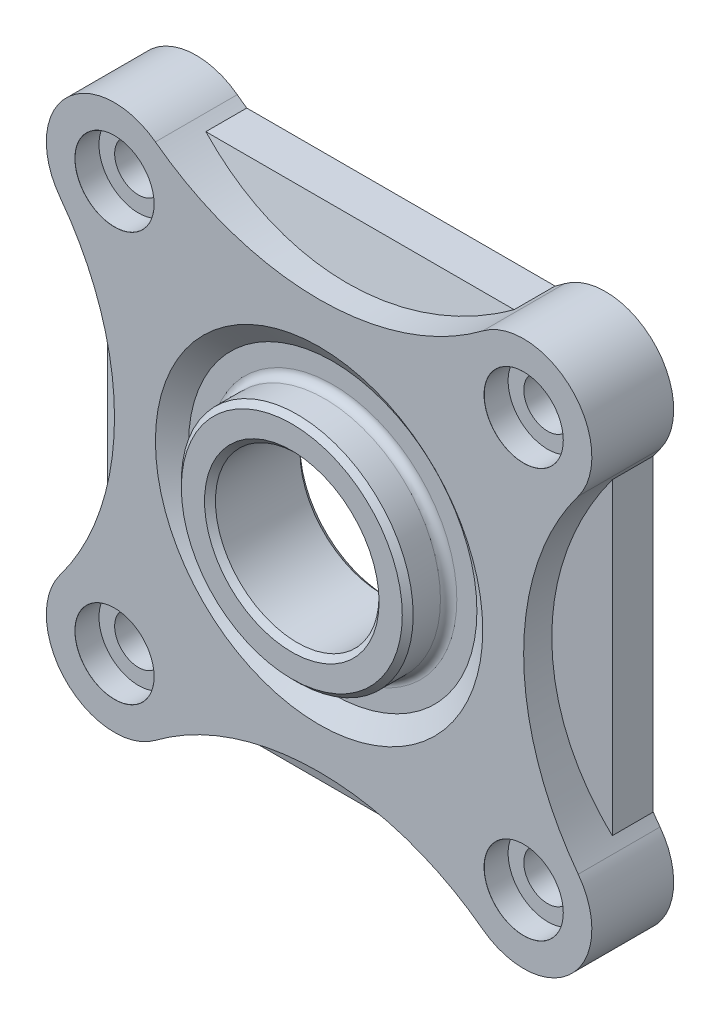
ISO-10303-21;
HEADER;
FILE_DESCRIPTION(('STEP AP214'),'2;1');
FILE_NAME('part.step','',(''),(''),'','','');
FILE_SCHEMA(('AUTOMOTIVE_DESIGN { 1 0 10303 214 1 1 1 1 }'));
ENDSEC;
DATA;
#1=APPLICATION_CONTEXT('core data for automotive mechanical design processes');
#2=APPLICATION_PROTOCOL_DEFINITION('international standard','automotive_design',2000,#1);
#3=PRODUCT_CONTEXT('',#1,'mechanical');
#4=PRODUCT('Part','Part','',(#3));
#5=PRODUCT_RELATED_PRODUCT_CATEGORY('part','',(#4));
#6=PRODUCT_DEFINITION_FORMATION('','',#4);
#7=PRODUCT_DEFINITION_CONTEXT('part definition',#1,'design');
#8=PRODUCT_DEFINITION('design','',#6,#7);
#9=PRODUCT_DEFINITION_SHAPE('','',#8);
#10=(LENGTH_UNIT() NAMED_UNIT(*) SI_UNIT(.MILLI.,.METRE.));
#11=(NAMED_UNIT(*) PLANE_ANGLE_UNIT() SI_UNIT($,.RADIAN.));
#12=(NAMED_UNIT(*) SI_UNIT($,.STERADIAN.) SOLID_ANGLE_UNIT());
#13=UNCERTAINTY_MEASURE_WITH_UNIT(LENGTH_MEASURE(1.E-05),#10,'distance_accuracy_value','');
#14=(GEOMETRIC_REPRESENTATION_CONTEXT(3) GLOBAL_UNCERTAINTY_ASSIGNED_CONTEXT((#13)) GLOBAL_UNIT_ASSIGNED_CONTEXT((#10,
#11,#12)) REPRESENTATION_CONTEXT('',''));
#15=CARTESIAN_POINT('',(0.,0.,0.));
#16=DIRECTION('',(0.,0.,1.));
#17=DIRECTION('',(1.,0.,0.));
#18=AXIS2_PLACEMENT_3D('',#15,#16,#17);
#19=CARTESIAN_POINT('',(0.,0.,0.));
#20=DIRECTION('',(0.,0.,1.));
#21=DIRECTION('',(1.,0.,0.));
#22=AXIS2_PLACEMENT_3D('',#19,#20,#21);
#23=CYLINDRICAL_SURFACE('',#22,30.);
#24=CARTESIAN_POINT('',(0.,0.,7.00000000000001));
#25=DIRECTION('',(0.,0.,-1.));
#26=DIRECTION('',(-1.,0.,0.));
#27=AXIS2_PLACEMENT_3D('',#24,#25,#26);
#28=CIRCLE('',#27,30.);
#29=CARTESIAN_POINT('',(-30.,0.,7.00000000000001));
#30=VERTEX_POINT('',#29);
#31=EDGE_CURVE('E280',#30,#30,#28,.T.);
#32=ORIENTED_EDGE('',*,*,#31,.T.);
#33=EDGE_LOOP('',(#32));
#34=FACE_BOUND('',#33,.T.);
#35=CARTESIAN_POINT('',(0.,0.,38.));
#36=DIRECTION('',(0.,0.,1.));
#37=DIRECTION('',(1.,0.,0.));
#38=AXIS2_PLACEMENT_3D('',#35,#36,#37);
#39=CIRCLE('',#38,30.);
#40=CARTESIAN_POINT('',(30.,0.,38.));
#41=VERTEX_POINT('',#40);
#42=EDGE_CURVE('E276',#41,#41,#39,.T.);
#43=ORIENTED_EDGE('',*,*,#42,.T.);
#44=EDGE_LOOP('',(#43));
#45=FACE_BOUND('',#44,.T.);
#46=ADVANCED_FACE('F45',(#34,#45),#23,.F.);
#47=CARTESIAN_POINT('',(0.,-175.,30.));
#48=DIRECTION('',(0.,0.,-1.));
#49=DIRECTION('',(-1.,0.,0.));
#50=AXIS2_PLACEMENT_3D('',#47,#48,#49);
#51=CYLINDRICAL_SURFACE('',#50,100.);
#52=CARTESIAN_POINT('',(0.,-175.,-7.10580837556768));
#53=DIRECTION('',(0.,-0.258819045102521,0.965925826289068));
#54=DIRECTION('',(0.,-0.965925826289068,-0.258819045102521));
#55=AXIS2_PLACEMENT_3D('',#52,#53,#54);
#56=ELLIPSE('',#55,103.527618041008,100.);
#57=CARTESIAN_POINT('',(-56.5132727772866,-92.5,15.));
#58=VERTEX_POINT('',#57);
#59=CARTESIAN_POINT('',(56.5132727772866,-92.5,15.));
#60=VERTEX_POINT('',#59);
#61=EDGE_CURVE('E177',#58,#60,#56,.F.);
#62=ORIENTED_EDGE('',*,*,#61,.T.);
#63=DIRECTION('',(0.,0.,-1.));
#64=VECTOR('',#63,1.);
#65=CARTESIAN_POINT('',(56.5132727772866,-92.5,30.));
#66=LINE('',#65,#64);
#67=CARTESIAN_POINT('',(56.5132727772866,-92.5,0.));
#68=VERTEX_POINT('',#67);
#69=EDGE_CURVE('E162',#60,#68,#66,.T.);
#70=ORIENTED_EDGE('',*,*,#69,.T.);
#71=CARTESIAN_POINT('',(0.,-175.,0.));
#72=DIRECTION('',(0.,0.,1.));
#73=DIRECTION('',(1.,0.,0.));
#74=AXIS2_PLACEMENT_3D('',#71,#72,#73);
#75=CIRCLE('',#74,100.);
#76=CARTESIAN_POINT('',(60.,-95.,0.));
#77=VERTEX_POINT('',#76);
#78=EDGE_CURVE('E176',#77,#68,#75,.T.);
#79=ORIENTED_EDGE('',*,*,#78,.F.);
#80=DIRECTION('',(0.,0.,-1.));
#81=VECTOR('',#80,1.);
#82=CARTESIAN_POINT('',(60.,-95.,30.));
#83=LINE('',#82,#81);
#84=CARTESIAN_POINT('',(60.,-95.,30.));
#85=VERTEX_POINT('',#84);
#86=EDGE_CURVE('E246',#85,#77,#83,.T.);
#87=ORIENTED_EDGE('',*,*,#86,.F.);
#88=CARTESIAN_POINT('',(0.,-175.,30.));
#89=DIRECTION('',(0.,0.,1.));
#90=DIRECTION('',(1.,0.,0.));
#91=AXIS2_PLACEMENT_3D('',#88,#89,#90);
#92=CIRCLE('',#91,100.);
#93=CARTESIAN_POINT('',(-60.,-95.,30.));
#94=VERTEX_POINT('',#93);
#95=EDGE_CURVE('E220',#85,#94,#92,.T.);
#96=ORIENTED_EDGE('',*,*,#95,.T.);
#97=DIRECTION('',(0.,0.,-1.));
#98=VECTOR('',#97,1.);
#99=CARTESIAN_POINT('',(-60.,-95.,30.));
#100=LINE('',#99,#98);
#101=CARTESIAN_POINT('',(-60.,-95.,0.));
#102=VERTEX_POINT('',#101);
#103=EDGE_CURVE('E221',#94,#102,#100,.T.);
#104=ORIENTED_EDGE('',*,*,#103,.T.);
#105=CARTESIAN_POINT('',(-56.5132727772866,-92.5,0.));
#106=VERTEX_POINT('',#105);
#107=EDGE_CURVE('E186',#106,#102,#75,.T.);
#108=ORIENTED_EDGE('',*,*,#107,.F.);
#109=DIRECTION('',(0.,0.,-1.));
#110=VECTOR('',#109,1.);
#111=CARTESIAN_POINT('',(-56.5132727772866,-92.5,30.));
#112=LINE('',#111,#110);
#113=EDGE_CURVE('E165',#106,#58,#112,.F.);
#114=ORIENTED_EDGE('',*,*,#113,.T.);
#115=EDGE_LOOP('',(#62,#70,#79,#87,#96,#104,#108,#114));
#116=FACE_BOUND('',#115,.T.);
#117=ADVANCED_FACE('F175',(#116),#51,.F.);
#118=CARTESIAN_POINT('',(175.,0.,30.));
#119=DIRECTION('',(0.,0.,-1.));
#120=DIRECTION('',(-1.,0.,0.));
#121=AXIS2_PLACEMENT_3D('',#118,#119,#120);
#122=CYLINDRICAL_SURFACE('',#121,100.);
#123=CARTESIAN_POINT('',(175.,0.,-7.10580837556767));
#124=DIRECTION('',(0.258819045102521,0.,0.965925826289068));
#125=DIRECTION('',(0.965925826289068,0.,-0.258819045102521));
#126=AXIS2_PLACEMENT_3D('',#123,#124,#125);
#127=ELLIPSE('',#126,103.527618041008,100.);
#128=CARTESIAN_POINT('',(92.5,-56.5132727772866,15.));
#129=VERTEX_POINT('',#128);
#130=CARTESIAN_POINT('',(92.5,56.5132727772866,15.));
#131=VERTEX_POINT('',#130);
#132=EDGE_CURVE('E250',#129,#131,#127,.F.);
#133=ORIENTED_EDGE('',*,*,#132,.T.);
#134=DIRECTION('',(0.,0.,-1.));
#135=VECTOR('',#134,1.);
#136=CARTESIAN_POINT('',(92.5,56.5132727772866,30.));
#137=LINE('',#136,#135);
#138=CARTESIAN_POINT('',(92.5,56.5132727772867,0.));
#139=VERTEX_POINT('',#138);
#140=EDGE_CURVE('E258',#131,#139,#137,.T.);
#141=ORIENTED_EDGE('',*,*,#140,.T.);
#142=CARTESIAN_POINT('',(175.,0.,0.));
#143=DIRECTION('',(0.,0.,1.));
#144=DIRECTION('',(1.,0.,0.));
#145=AXIS2_PLACEMENT_3D('',#142,#143,#144);
#146=CIRCLE('',#145,100.);
#147=CARTESIAN_POINT('',(95.,60.,0.));
#148=VERTEX_POINT('',#147);
#149=EDGE_CURVE('E196',#148,#139,#146,.T.);
#150=ORIENTED_EDGE('',*,*,#149,.F.);
#151=DIRECTION('',(0.,0.,-1.));
#152=VECTOR('',#151,1.);
#153=CARTESIAN_POINT('',(95.,60.,30.));
#154=LINE('',#153,#152);
#155=CARTESIAN_POINT('',(95.,60.,30.));
#156=VERTEX_POINT('',#155);
#157=EDGE_CURVE('E239',#156,#148,#154,.T.);
#158=ORIENTED_EDGE('',*,*,#157,.F.);
#159=CARTESIAN_POINT('',(175.,0.,30.));
#160=DIRECTION('',(0.,0.,1.));
#161=DIRECTION('',(1.,0.,0.));
#162=AXIS2_PLACEMENT_3D('',#159,#160,#161);
#163=CIRCLE('',#162,100.);
#164=CARTESIAN_POINT('',(95.,-60.,30.));
#165=VERTEX_POINT('',#164);
#166=EDGE_CURVE('E614',#156,#165,#163,.T.);
#167=ORIENTED_EDGE('',*,*,#166,.T.);
#168=DIRECTION('',(0.,0.,-1.));
#169=VECTOR('',#168,1.);
#170=CARTESIAN_POINT('',(95.,-60.,30.));
#171=LINE('',#170,#169);
#172=CARTESIAN_POINT('',(95.,-60.,0.));
#173=VERTEX_POINT('',#172);
#174=EDGE_CURVE('E242',#165,#173,#171,.T.);
#175=ORIENTED_EDGE('',*,*,#174,.T.);
#176=CARTESIAN_POINT('',(92.5,-56.5132727772866,0.));
#177=VERTEX_POINT('',#176);
#178=EDGE_CURVE('E190',#177,#173,#146,.T.);
#179=ORIENTED_EDGE('',*,*,#178,.F.);
#180=DIRECTION('',(0.,0.,-1.));
#181=VECTOR('',#180,1.);
#182=CARTESIAN_POINT('',(92.5,-56.5132727772866,30.));
#183=LINE('',#182,#181);
#184=EDGE_CURVE('E601',#177,#129,#183,.F.);
#185=ORIENTED_EDGE('',*,*,#184,.T.);
#186=EDGE_LOOP('',(#133,#141,#150,#158,#167,#175,#179,#185));
#187=FACE_BOUND('',#186,.T.);
#188=ADVANCED_FACE('F306',(#187),#122,.F.);
#189=CARTESIAN_POINT('',(0.,175.,30.));
#190=DIRECTION('',(0.,0.,-1.));
#191=DIRECTION('',(-1.,0.,0.));
#192=AXIS2_PLACEMENT_3D('',#189,#190,#191);
#193=CYLINDRICAL_SURFACE('',#192,100.);
#194=CARTESIAN_POINT('',(0.,175.,-7.10580837556768));
#195=DIRECTION('',(0.,0.258819045102521,0.965925826289068));
#196=DIRECTION('',(0.,0.965925826289068,-0.258819045102521));
#197=AXIS2_PLACEMENT_3D('',#194,#195,#196);
#198=ELLIPSE('',#197,103.527618041008,100.);
#199=CARTESIAN_POINT('',(56.5132727772866,92.5,15.));
#200=VERTEX_POINT('',#199);
#201=CARTESIAN_POINT('',(-56.5132727772866,92.5,15.));
#202=VERTEX_POINT('',#201);
#203=EDGE_CURVE('E254',#200,#202,#198,.F.);
#204=ORIENTED_EDGE('',*,*,#203,.T.);
#205=DIRECTION('',(0.,0.,-1.));
#206=VECTOR('',#205,1.);
#207=CARTESIAN_POINT('',(-56.5132727772866,92.5,30.));
#208=LINE('',#207,#206);
#209=CARTESIAN_POINT('',(-56.5132727772866,92.5,0.));
#210=VERTEX_POINT('',#209);
#211=EDGE_CURVE('E597',#202,#210,#208,.T.);
#212=ORIENTED_EDGE('',*,*,#211,.T.);
#213=CARTESIAN_POINT('',(0.,175.,0.));
#214=DIRECTION('',(0.,0.,1.));
#215=DIRECTION('',(1.,0.,0.));
#216=AXIS2_PLACEMENT_3D('',#213,#214,#215);
#217=CIRCLE('',#216,100.);
#218=CARTESIAN_POINT('',(-60.,95.,0.));
#219=VERTEX_POINT('',#218);
#220=EDGE_CURVE('E204',#219,#210,#217,.T.);
#221=ORIENTED_EDGE('',*,*,#220,.F.);
#222=DIRECTION('',(0.,0.,-1.));
#223=VECTOR('',#222,1.);
#224=CARTESIAN_POINT('',(-60.,95.,30.));
#225=LINE('',#224,#223);
#226=CARTESIAN_POINT('',(-60.,95.,30.));
#227=VERTEX_POINT('',#226);
#228=EDGE_CURVE('E232',#227,#219,#225,.T.);
#229=ORIENTED_EDGE('',*,*,#228,.F.);
#230=CARTESIAN_POINT('',(0.,175.,30.));
#231=DIRECTION('',(0.,0.,1.));
#232=DIRECTION('',(1.,0.,0.));
#233=AXIS2_PLACEMENT_3D('',#230,#231,#232);
#234=CIRCLE('',#233,100.);
#235=CARTESIAN_POINT('',(60.,95.,30.));
#236=VERTEX_POINT('',#235);
#237=EDGE_CURVE('E621',#227,#236,#234,.T.);
#238=ORIENTED_EDGE('',*,*,#237,.T.);
#239=DIRECTION('',(0.,0.,-1.));
#240=VECTOR('',#239,1.);
#241=CARTESIAN_POINT('',(60.,95.,30.));
#242=LINE('',#241,#240);
#243=CARTESIAN_POINT('',(60.,95.,0.));
#244=VERTEX_POINT('',#243);
#245=EDGE_CURVE('E235',#236,#244,#242,.T.);
#246=ORIENTED_EDGE('',*,*,#245,.T.);
#247=CARTESIAN_POINT('',(56.5132727772866,92.5,0.));
#248=VERTEX_POINT('',#247);
#249=EDGE_CURVE('E203',#248,#244,#217,.T.);
#250=ORIENTED_EDGE('',*,*,#249,.F.);
#251=DIRECTION('',(0.,0.,-1.));
#252=VECTOR('',#251,1.);
#253=CARTESIAN_POINT('',(56.5132727772866,92.5,30.));
#254=LINE('',#253,#252);
#255=EDGE_CURVE('E593',#248,#200,#254,.F.);
#256=ORIENTED_EDGE('',*,*,#255,.T.);
#257=EDGE_LOOP('',(#204,#212,#221,#229,#238,#246,#250,#256));
#258=FACE_BOUND('',#257,.T.);
#259=ADVANCED_FACE('F417',(#258),#193,.F.);
#260=CARTESIAN_POINT('',(-175.,0.,30.));
#261=DIRECTION('',(0.,0.,-1.));
#262=DIRECTION('',(-1.,0.,0.));
#263=AXIS2_PLACEMENT_3D('',#260,#261,#262);
#264=CYLINDRICAL_SURFACE('',#263,100.);
#265=CARTESIAN_POINT('',(-175.,0.,-7.10580837556769));
#266=DIRECTION('',(-0.258819045102521,0.,0.965925826289068));
#267=DIRECTION('',(-0.965925826289068,0.,-0.258819045102521));
#268=AXIS2_PLACEMENT_3D('',#265,#266,#267);
#269=ELLIPSE('',#268,103.527618041008,100.);
#270=CARTESIAN_POINT('',(-92.5,56.5132727772866,15.));
#271=VERTEX_POINT('',#270);
#272=CARTESIAN_POINT('',(-92.5,-56.5132727772866,15.));
#273=VERTEX_POINT('',#272);
#274=EDGE_CURVE('E249',#271,#273,#269,.F.);
#275=ORIENTED_EDGE('',*,*,#274,.T.);
#276=DIRECTION('',(0.,0.,-1.));
#277=VECTOR('',#276,1.);
#278=CARTESIAN_POINT('',(-92.5,-56.5132727772866,30.));
#279=LINE('',#278,#277);
#280=CARTESIAN_POINT('',(-92.5,-56.5132727772866,0.));
#281=VERTEX_POINT('',#280);
#282=EDGE_CURVE('E589',#273,#281,#279,.T.);
#283=ORIENTED_EDGE('',*,*,#282,.T.);
#284=CARTESIAN_POINT('',(-175.,0.,0.));
#285=DIRECTION('',(0.,0.,1.));
#286=DIRECTION('',(1.,0.,0.));
#287=AXIS2_PLACEMENT_3D('',#284,#285,#286);
#288=CIRCLE('',#287,100.);
#289=CARTESIAN_POINT('',(-95.,-60.,0.));
#290=VERTEX_POINT('',#289);
#291=EDGE_CURVE('E212',#290,#281,#288,.T.);
#292=ORIENTED_EDGE('',*,*,#291,.F.);
#293=DIRECTION('',(0.,0.,-1.));
#294=VECTOR('',#293,1.);
#295=CARTESIAN_POINT('',(-95.,-60.,30.));
#296=LINE('',#295,#294);
#297=CARTESIAN_POINT('',(-95.,-60.,30.));
#298=VERTEX_POINT('',#297);
#299=EDGE_CURVE('E225',#298,#290,#296,.T.);
#300=ORIENTED_EDGE('',*,*,#299,.F.);
#301=CARTESIAN_POINT('',(-175.,0.,30.));
#302=DIRECTION('',(0.,0.,1.));
#303=DIRECTION('',(1.,0.,0.));
#304=AXIS2_PLACEMENT_3D('',#301,#302,#303);
#305=CIRCLE('',#304,100.);
#306=CARTESIAN_POINT('',(-95.,60.,30.));
#307=VERTEX_POINT('',#306);
#308=EDGE_CURVE('E627',#298,#307,#305,.T.);
#309=ORIENTED_EDGE('',*,*,#308,.T.);
#310=DIRECTION('',(0.,0.,-1.));
#311=VECTOR('',#310,1.);
#312=CARTESIAN_POINT('',(-95.,60.,30.));
#313=LINE('',#312,#311);
#314=CARTESIAN_POINT('',(-95.,60.,0.));
#315=VERTEX_POINT('',#314);
#316=EDGE_CURVE('E228',#307,#315,#313,.T.);
#317=ORIENTED_EDGE('',*,*,#316,.T.);
#318=CARTESIAN_POINT('',(-92.5,56.5132727772866,0.));
#319=VERTEX_POINT('',#318);
#320=EDGE_CURVE('E211',#319,#315,#288,.T.);
#321=ORIENTED_EDGE('',*,*,#320,.F.);
#322=DIRECTION('',(0.,0.,-1.));
#323=VECTOR('',#322,1.);
#324=CARTESIAN_POINT('',(-92.5,56.5132727772866,30.));
#325=LINE('',#324,#323);
#326=EDGE_CURVE('E179',#319,#271,#325,.F.);
#327=ORIENTED_EDGE('',*,*,#326,.T.);
#328=EDGE_LOOP('',(#275,#283,#292,#300,#309,#317,#321,#327));
#329=FACE_BOUND('',#328,.T.);
#330=ADVANCED_FACE('F413',(#329),#264,.F.);
#331=CARTESIAN_POINT('',(75.,-75.,30.));
#332=DIRECTION('',(0.,0.,-1.));
#333=DIRECTION('',(-1.,0.,0.));
#334=AXIS2_PLACEMENT_3D('',#331,#332,#333);
#335=CYLINDRICAL_SURFACE('',#334,25.);
#336=CARTESIAN_POINT('',(75.,-75.,0.));
#337=DIRECTION('',(0.,0.,1.));
#338=DIRECTION('',(1.,0.,0.));
#339=AXIS2_PLACEMENT_3D('',#336,#337,#338);
#340=CIRCLE('',#339,25.);
#341=EDGE_CURVE('E184',#77,#173,#340,.T.);
#342=ORIENTED_EDGE('',*,*,#341,.T.);
#343=ORIENTED_EDGE('',*,*,#174,.F.);
#344=CARTESIAN_POINT('',(75.,-75.,30.));
#345=DIRECTION('',(0.,0.,1.));
#346=DIRECTION('',(1.,0.,0.));
#347=AXIS2_PLACEMENT_3D('',#344,#345,#346);
#348=CIRCLE('',#347,25.);
#349=EDGE_CURVE('E611',#85,#165,#348,.T.);
#350=ORIENTED_EDGE('',*,*,#349,.F.);
#351=ORIENTED_EDGE('',*,*,#86,.T.);
#352=EDGE_LOOP('',(#342,#343,#350,#351));
#353=FACE_BOUND('',#352,.T.);
#354=ADVANCED_FACE('F416',(#353),#335,.T.);
#355=CARTESIAN_POINT('',(75.,75.,30.));
#356=DIRECTION('',(0.,0.,-1.));
#357=DIRECTION('',(-1.,0.,0.));
#358=AXIS2_PLACEMENT_3D('',#355,#356,#357);
#359=CYLINDRICAL_SURFACE('',#358,25.);
#360=CARTESIAN_POINT('',(75.,75.,0.));
#361=DIRECTION('',(0.,0.,1.));
#362=DIRECTION('',(1.,0.,0.));
#363=AXIS2_PLACEMENT_3D('',#360,#361,#362);
#364=CIRCLE('',#363,25.);
#365=EDGE_CURVE('E199',#148,#244,#364,.T.);
#366=ORIENTED_EDGE('',*,*,#365,.T.);
#367=ORIENTED_EDGE('',*,*,#245,.F.);
#368=CARTESIAN_POINT('',(75.,75.,30.));
#369=DIRECTION('',(0.,0.,1.));
#370=DIRECTION('',(1.,0.,0.));
#371=AXIS2_PLACEMENT_3D('',#368,#369,#370);
#372=CIRCLE('',#371,25.);
#373=EDGE_CURVE('E618',#156,#236,#372,.T.);
#374=ORIENTED_EDGE('',*,*,#373,.F.);
#375=ORIENTED_EDGE('',*,*,#157,.T.);
#376=EDGE_LOOP('',(#366,#367,#374,#375));
#377=FACE_BOUND('',#376,.T.);
#378=ADVANCED_FACE('F421',(#377),#359,.T.);
#379=CARTESIAN_POINT('',(-75.,75.,30.));
#380=DIRECTION('',(0.,0.,-1.));
#381=DIRECTION('',(-1.,0.,0.));
#382=AXIS2_PLACEMENT_3D('',#379,#380,#381);
#383=CYLINDRICAL_SURFACE('',#382,25.);
#384=CARTESIAN_POINT('',(-75.,75.,0.));
#385=DIRECTION('',(0.,0.,1.));
#386=DIRECTION('',(1.,0.,0.));
#387=AXIS2_PLACEMENT_3D('',#384,#385,#386);
#388=CIRCLE('',#387,25.);
#389=EDGE_CURVE('E207',#219,#315,#388,.T.);
#390=ORIENTED_EDGE('',*,*,#389,.T.);
#391=ORIENTED_EDGE('',*,*,#316,.F.);
#392=CARTESIAN_POINT('',(-75.,75.,30.));
#393=DIRECTION('',(0.,0.,1.));
#394=DIRECTION('',(1.,0.,0.));
#395=AXIS2_PLACEMENT_3D('',#392,#393,#394);
#396=CIRCLE('',#395,25.);
#397=EDGE_CURVE('E625',#227,#307,#396,.T.);
#398=ORIENTED_EDGE('',*,*,#397,.F.);
#399=ORIENTED_EDGE('',*,*,#228,.T.);
#400=EDGE_LOOP('',(#390,#391,#398,#399));
#401=FACE_BOUND('',#400,.T.);
#402=ADVANCED_FACE('F411',(#401),#383,.T.);
#403=CARTESIAN_POINT('',(-75.,-75.,30.));
#404=DIRECTION('',(0.,0.,-1.));
#405=DIRECTION('',(-1.,0.,0.));
#406=AXIS2_PLACEMENT_3D('',#403,#404,#405);
#407=CYLINDRICAL_SURFACE('',#406,25.);
#408=CARTESIAN_POINT('',(-75.,-75.,0.));
#409=DIRECTION('',(0.,0.,1.));
#410=DIRECTION('',(1.,0.,0.));
#411=AXIS2_PLACEMENT_3D('',#408,#409,#410);
#412=CIRCLE('',#411,25.);
#413=EDGE_CURVE('E216',#290,#102,#412,.T.);
#414=ORIENTED_EDGE('',*,*,#413,.T.);
#415=ORIENTED_EDGE('',*,*,#103,.F.);
#416=CARTESIAN_POINT('',(-75.,-75.,30.));
#417=DIRECTION('',(0.,0.,1.));
#418=DIRECTION('',(1.,0.,0.));
#419=AXIS2_PLACEMENT_3D('',#416,#417,#418);
#420=CIRCLE('',#419,25.);
#421=EDGE_CURVE('E193',#298,#94,#420,.T.);
#422=ORIENTED_EDGE('',*,*,#421,.F.);
#423=ORIENTED_EDGE('',*,*,#299,.T.);
#424=EDGE_LOOP('',(#414,#415,#422,#423));
#425=FACE_BOUND('',#424,.T.);
#426=ADVANCED_FACE('F404',(#425),#407,.T.);
#427=CARTESIAN_POINT('',(0.,0.,30.));
#428=DIRECTION('',(0.,0.,1.));
#429=DIRECTION('',(1.,0.,0.));
#430=AXIS2_PLACEMENT_3D('',#427,#428,#429);
#431=PLANE('',#430);
#432=CARTESIAN_POINT('',(0.,0.,30.));
#433=DIRECTION('',(0.,0.,1.));
#434=DIRECTION('',(1.,0.,0.));
#435=AXIS2_PLACEMENT_3D('',#432,#433,#434);
#436=CIRCLE('',#435,60.);
#437=CARTESIAN_POINT('',(60.,0.,30.));
#438=VERTEX_POINT('',#437);
#439=EDGE_CURVE('E484',#438,#438,#436,.T.);
#440=ORIENTED_EDGE('',*,*,#439,.F.);
#441=EDGE_LOOP('',(#440));
#442=FACE_BOUND('',#441,.T.);
#443=CARTESIAN_POINT('',(-75.,75.,30.));
#444=DIRECTION('',(0.,0.,1.));
#445=DIRECTION('',(1.,0.,0.));
#446=AXIS2_PLACEMENT_3D('',#443,#444,#445);
#447=CIRCLE('',#446,14.525);
#448=CARTESIAN_POINT('',(-60.475,75.,30.));
#449=VERTEX_POINT('',#448);
#450=EDGE_CURVE('E475',#449,#449,#447,.T.);
#451=ORIENTED_EDGE('',*,*,#450,.F.);
#452=EDGE_LOOP('',(#451));
#453=FACE_BOUND('',#452,.T.);
#454=CARTESIAN_POINT('',(75.,75.,30.));
#455=DIRECTION('',(0.,0.,1.));
#456=DIRECTION('',(1.,0.,0.));
#457=AXIS2_PLACEMENT_3D('',#454,#455,#456);
#458=CIRCLE('',#457,14.525);
#459=CARTESIAN_POINT('',(89.525,75.,30.));
#460=VERTEX_POINT('',#459);
#461=EDGE_CURVE('E504',#460,#460,#458,.T.);
#462=ORIENTED_EDGE('',*,*,#461,.F.);
#463=EDGE_LOOP('',(#462));
#464=FACE_BOUND('',#463,.T.);
#465=CARTESIAN_POINT('',(-75.,-75.,30.));
#466=DIRECTION('',(0.,0.,1.));
#467=DIRECTION('',(1.,0.,0.));
#468=AXIS2_PLACEMENT_3D('',#465,#466,#467);
#469=CIRCLE('',#468,14.525);
#470=CARTESIAN_POINT('',(-60.475,-75.,30.));
#471=VERTEX_POINT('',#470);
#472=EDGE_CURVE('E524',#471,#471,#469,.T.);
#473=ORIENTED_EDGE('',*,*,#472,.F.);
#474=EDGE_LOOP('',(#473));
#475=FACE_BOUND('',#474,.T.);
#476=CARTESIAN_POINT('',(75.,-75.,30.));
#477=DIRECTION('',(0.,0.,1.));
#478=DIRECTION('',(1.,0.,0.));
#479=AXIS2_PLACEMENT_3D('',#476,#477,#478);
#480=CIRCLE('',#479,14.525);
#481=CARTESIAN_POINT('',(89.525,-75.,30.));
#482=VERTEX_POINT('',#481);
#483=EDGE_CURVE('E544',#482,#482,#480,.T.);
#484=ORIENTED_EDGE('',*,*,#483,.F.);
#485=EDGE_LOOP('',(#484));
#486=FACE_BOUND('',#485,.T.);
#487=ORIENTED_EDGE('',*,*,#95,.F.);
#488=ORIENTED_EDGE('',*,*,#349,.T.);
#489=ORIENTED_EDGE('',*,*,#166,.F.);
#490=ORIENTED_EDGE('',*,*,#373,.T.);
#491=ORIENTED_EDGE('',*,*,#237,.F.);
#492=ORIENTED_EDGE('',*,*,#397,.T.);
#493=ORIENTED_EDGE('',*,*,#308,.F.);
#494=ORIENTED_EDGE('',*,*,#421,.T.);
#495=EDGE_LOOP('',(#487,#488,#489,#490,#491,#492,#493,#494));
#496=FACE_BOUND('',#495,.T.);
#497=ADVANCED_FACE('F401',(#442,#453,#464,#475,#486,#496),#431,.T.);
#498=CARTESIAN_POINT('',(0.,0.,0.));
#499=DIRECTION('',(0.,0.,1.));
#500=DIRECTION('',(1.,0.,0.));
#501=AXIS2_PLACEMENT_3D('',#498,#499,#500);
#502=PLANE('',#501);
#503=CARTESIAN_POINT('',(0.,0.,0.));
#504=DIRECTION('',(0.,0.,-1.));
#505=DIRECTION('',(-1.,0.,0.));
#506=AXIS2_PLACEMENT_3D('',#503,#504,#505);
#507=CIRCLE('',#506,77.5);
#508=CARTESIAN_POINT('',(-77.5,0.,0.));
#509=VERTEX_POINT('',#508);
#510=EDGE_CURVE('E476',#509,#509,#507,.T.);
#511=ORIENTED_EDGE('',*,*,#510,.F.);
#512=EDGE_LOOP('',(#511));
#513=FACE_BOUND('',#512,.T.);
#514=CARTESIAN_POINT('',(-75.,75.,0.));
#515=DIRECTION('',(0.,0.,1.));
#516=DIRECTION('',(1.,0.,0.));
#517=AXIS2_PLACEMENT_3D('',#514,#515,#516);
#518=CIRCLE('',#517,8.74999999999999);
#519=CARTESIAN_POINT('',(-66.25,75.,0.));
#520=VERTEX_POINT('',#519);
#521=EDGE_CURVE('E500',#520,#520,#518,.T.);
#522=ORIENTED_EDGE('',*,*,#521,.T.);
#523=EDGE_LOOP('',(#522));
#524=FACE_BOUND('',#523,.T.);
#525=CARTESIAN_POINT('',(75.,75.,0.));
#526=DIRECTION('',(0.,0.,1.));
#527=DIRECTION('',(1.,0.,0.));
#528=AXIS2_PLACEMENT_3D('',#525,#526,#527);
#529=CIRCLE('',#528,8.74999999999999);
#530=CARTESIAN_POINT('',(83.75,75.,0.));
#531=VERTEX_POINT('',#530);
#532=EDGE_CURVE('E520',#531,#531,#529,.T.);
#533=ORIENTED_EDGE('',*,*,#532,.T.);
#534=EDGE_LOOP('',(#533));
#535=FACE_BOUND('',#534,.T.);
#536=CARTESIAN_POINT('',(-75.,-75.,0.));
#537=DIRECTION('',(0.,0.,1.));
#538=DIRECTION('',(1.,0.,0.));
#539=AXIS2_PLACEMENT_3D('',#536,#537,#538);
#540=CIRCLE('',#539,8.74999999999999);
#541=CARTESIAN_POINT('',(-66.25,-75.,0.));
#542=VERTEX_POINT('',#541);
#543=EDGE_CURVE('E540',#542,#542,#540,.T.);
#544=ORIENTED_EDGE('',*,*,#543,.T.);
#545=EDGE_LOOP('',(#544));
#546=FACE_BOUND('',#545,.T.);
#547=CARTESIAN_POINT('',(75.,-75.,0.));
#548=DIRECTION('',(0.,0.,1.));
#549=DIRECTION('',(1.,0.,0.));
#550=AXIS2_PLACEMENT_3D('',#547,#548,#549);
#551=CIRCLE('',#550,8.74999999999999);
#552=CARTESIAN_POINT('',(83.75,-75.,0.));
#553=VERTEX_POINT('',#552);
#554=EDGE_CURVE('E560',#553,#553,#551,.T.);
#555=ORIENTED_EDGE('',*,*,#554,.T.);
#556=EDGE_LOOP('',(#555));
#557=FACE_BOUND('',#556,.T.);
#558=ORIENTED_EDGE('',*,*,#149,.T.);
#559=DIRECTION('',(0.,1.,0.));
#560=VECTOR('',#559,1.);
#561=CARTESIAN_POINT('',(92.5,-92.5,0.));
#562=LINE('',#561,#560);
#563=EDGE_CURVE('E62',#177,#139,#562,.T.);
#564=ORIENTED_EDGE('',*,*,#563,.F.);
#565=ORIENTED_EDGE('',*,*,#178,.T.);
#566=ORIENTED_EDGE('',*,*,#341,.F.);
#567=ORIENTED_EDGE('',*,*,#78,.T.);
#568=DIRECTION('',(1.,0.,0.));
#569=VECTOR('',#568,1.);
#570=CARTESIAN_POINT('',(-92.5,-92.5,0.));
#571=LINE('',#570,#569);
#572=EDGE_CURVE('E158',#106,#68,#571,.T.);
#573=ORIENTED_EDGE('',*,*,#572,.F.);
#574=ORIENTED_EDGE('',*,*,#107,.T.);
#575=ORIENTED_EDGE('',*,*,#413,.F.);
#576=ORIENTED_EDGE('',*,*,#291,.T.);
#577=DIRECTION('',(0.,-1.,0.));
#578=VECTOR('',#577,1.);
#579=CARTESIAN_POINT('',(-92.5,-92.5,0.));
#580=LINE('',#579,#578);
#581=EDGE_CURVE('E170',#319,#281,#580,.T.);
#582=ORIENTED_EDGE('',*,*,#581,.F.);
#583=ORIENTED_EDGE('',*,*,#320,.T.);
#584=ORIENTED_EDGE('',*,*,#389,.F.);
#585=ORIENTED_EDGE('',*,*,#220,.T.);
#586=DIRECTION('',(-1.,0.,0.));
#587=VECTOR('',#586,1.);
#588=CARTESIAN_POINT('',(-92.5,92.5,0.));
#589=LINE('',#588,#587);
#590=EDGE_CURVE('E69',#248,#210,#589,.T.);
#591=ORIENTED_EDGE('',*,*,#590,.F.);
#592=ORIENTED_EDGE('',*,*,#249,.T.);
#593=ORIENTED_EDGE('',*,*,#365,.F.);
#594=EDGE_LOOP('',(#558,#564,#565,#566,#567,#573,#574,#575,#576,#582,#583,#584,#585,#591,#592,#593));
#595=FACE_BOUND('',#594,.T.);
#596=ADVANCED_FACE('F182',(#513,#524,#535,#546,#557,#595),#502,.F.);
#597=CARTESIAN_POINT('',(-92.5,-92.5,15.));
#598=DIRECTION('',(-0.258819045102521,0.,0.965925826289068));
#599=DIRECTION('',(0.965925826289068,0.,0.258819045102521));
#600=AXIS2_PLACEMENT_3D('',#597,#598,#599);
#601=PLANE('',#600);
#602=ORIENTED_EDGE('',*,*,#274,.F.);
#603=DIRECTION('',(0.,-1.,0.));
#604=VECTOR('',#603,1.);
#605=CARTESIAN_POINT('',(-92.5,-92.5,15.));
#606=LINE('',#605,#604);
#607=EDGE_CURVE('E571',#271,#273,#606,.T.);
#608=ORIENTED_EDGE('',*,*,#607,.T.);
#609=EDGE_LOOP('',(#602,#608));
#610=FACE_BOUND('',#609,.T.);
#611=ADVANCED_FACE('F390',(#610),#601,.T.);
#612=CARTESIAN_POINT('',(-92.5,-92.5,15.));
#613=DIRECTION('',(1.,0.,0.));
#614=DIRECTION('',(0.,0.,-1.));
#615=AXIS2_PLACEMENT_3D('',#612,#613,#614);
#616=PLANE('',#615);
#617=ORIENTED_EDGE('',*,*,#282,.F.);
#618=ORIENTED_EDGE('',*,*,#607,.F.);
#619=ORIENTED_EDGE('',*,*,#326,.F.);
#620=ORIENTED_EDGE('',*,*,#581,.T.);
#621=EDGE_LOOP('',(#617,#618,#619,#620));
#622=FACE_BOUND('',#621,.T.);
#623=ADVANCED_FACE('F386',(#622),#616,.F.);
#624=CARTESIAN_POINT('',(-92.5,92.5,15.));
#625=DIRECTION('',(0.,0.258819045102521,0.965925826289068));
#626=DIRECTION('',(0.,-0.965925826289068,0.258819045102521));
#627=AXIS2_PLACEMENT_3D('',#624,#625,#626);
#628=PLANE('',#627);
#629=ORIENTED_EDGE('',*,*,#203,.F.);
#630=DIRECTION('',(-1.,0.,0.));
#631=VECTOR('',#630,1.);
#632=CARTESIAN_POINT('',(-92.5,92.5,15.));
#633=LINE('',#632,#631);
#634=EDGE_CURVE('E567',#200,#202,#633,.T.);
#635=ORIENTED_EDGE('',*,*,#634,.T.);
#636=EDGE_LOOP('',(#629,#635));
#637=FACE_BOUND('',#636,.T.);
#638=ADVANCED_FACE('F389',(#637),#628,.T.);
#639=CARTESIAN_POINT('',(-92.5,92.5,15.));
#640=DIRECTION('',(0.,-1.,0.));
#641=DIRECTION('',(0.,0.,-1.));
#642=AXIS2_PLACEMENT_3D('',#639,#640,#641);
#643=PLANE('',#642);
#644=ORIENTED_EDGE('',*,*,#211,.F.);
#645=ORIENTED_EDGE('',*,*,#634,.F.);
#646=ORIENTED_EDGE('',*,*,#255,.F.);
#647=ORIENTED_EDGE('',*,*,#590,.T.);
#648=EDGE_LOOP('',(#644,#645,#646,#647));
#649=FACE_BOUND('',#648,.T.);
#650=ADVANCED_FACE('F392',(#649),#643,.F.);
#651=CARTESIAN_POINT('',(92.5,-92.5,15.));
#652=DIRECTION('',(0.258819045102521,0.,0.965925826289068));
#653=DIRECTION('',(0.965925826289068,0.,-0.258819045102521));
#654=AXIS2_PLACEMENT_3D('',#651,#652,#653);
#655=PLANE('',#654);
#656=ORIENTED_EDGE('',*,*,#132,.F.);
#657=DIRECTION('',(0.,1.,0.));
#658=VECTOR('',#657,1.);
#659=CARTESIAN_POINT('',(92.5,-92.5,15.));
#660=LINE('',#659,#658);
#661=EDGE_CURVE('E169',#129,#131,#660,.T.);
#662=ORIENTED_EDGE('',*,*,#661,.T.);
#663=EDGE_LOOP('',(#656,#662));
#664=FACE_BOUND('',#663,.T.);
#665=ADVANCED_FACE('F395',(#664),#655,.T.);
#666=CARTESIAN_POINT('',(92.5,-92.5,15.));
#667=DIRECTION('',(-1.,0.,0.));
#668=DIRECTION('',(0.,0.,1.));
#669=AXIS2_PLACEMENT_3D('',#666,#667,#668);
#670=PLANE('',#669);
#671=ORIENTED_EDGE('',*,*,#140,.F.);
#672=ORIENTED_EDGE('',*,*,#661,.F.);
#673=ORIENTED_EDGE('',*,*,#184,.F.);
#674=ORIENTED_EDGE('',*,*,#563,.T.);
#675=EDGE_LOOP('',(#671,#672,#673,#674));
#676=FACE_BOUND('',#675,.T.);
#677=ADVANCED_FACE('F397',(#676),#670,.F.);
#678=CARTESIAN_POINT('',(-92.5,-92.5,15.));
#679=DIRECTION('',(0.,-0.258819045102521,0.965925826289068));
#680=DIRECTION('',(0.,-0.965925826289068,-0.258819045102521));
#681=AXIS2_PLACEMENT_3D('',#678,#679,#680);
#682=PLANE('',#681);
#683=ORIENTED_EDGE('',*,*,#61,.F.);
#684=DIRECTION('',(1.,0.,0.));
#685=VECTOR('',#684,1.);
#686=CARTESIAN_POINT('',(-92.5,-92.5,15.));
#687=LINE('',#686,#685);
#688=EDGE_CURVE('E575',#58,#60,#687,.T.);
#689=ORIENTED_EDGE('',*,*,#688,.T.);
#690=EDGE_LOOP('',(#683,#689));
#691=FACE_BOUND('',#690,.T.);
#692=ADVANCED_FACE('F385',(#691),#682,.T.);
#693=CARTESIAN_POINT('',(-92.5,-92.5,15.));
#694=DIRECTION('',(0.,1.,0.));
#695=DIRECTION('',(0.,0.,1.));
#696=AXIS2_PLACEMENT_3D('',#693,#694,#695);
#697=PLANE('',#696);
#698=ORIENTED_EDGE('',*,*,#69,.F.);
#699=ORIENTED_EDGE('',*,*,#688,.F.);
#700=ORIENTED_EDGE('',*,*,#113,.F.);
#701=ORIENTED_EDGE('',*,*,#572,.T.);
#702=EDGE_LOOP('',(#698,#699,#700,#701));
#703=FACE_BOUND('',#702,.T.);
#704=ADVANCED_FACE('F160',(#703),#697,.F.);
#705=CARTESIAN_POINT('',(0.,0.,40.));
#706=DIRECTION('',(0.,0.,-1.));
#707=DIRECTION('',(-1.,0.,0.));
#708=AXIS2_PLACEMENT_3D('',#705,#706,#707);
#709=CYLINDRICAL_SURFACE('',#708,42.5);
#710=CARTESIAN_POINT('',(0.,0.,38.));
#711=DIRECTION('',(0.,0.,1.));
#712=DIRECTION('',(1.,0.,0.));
#713=AXIS2_PLACEMENT_3D('',#710,#711,#712);
#714=CIRCLE('',#713,42.5);
#715=CARTESIAN_POINT('',(42.5,0.,38.));
#716=VERTEX_POINT('',#715);
#717=EDGE_CURVE('E11',#716,#716,#714,.F.);
#718=ORIENTED_EDGE('',*,*,#717,.T.);
#719=EDGE_LOOP('',(#718));
#720=FACE_BOUND('',#719,.T.);
#721=CARTESIAN_POINT('',(0.,0.,28.));
#722=DIRECTION('',(0.,0.,1.));
#723=DIRECTION('',(1.,0.,0.));
#724=AXIS2_PLACEMENT_3D('',#721,#722,#723);
#725=CIRCLE('',#724,42.5);
#726=CARTESIAN_POINT('',(42.5,0.,28.));
#727=VERTEX_POINT('',#726);
#728=EDGE_CURVE('E262',#727,#727,#725,.T.);
#729=ORIENTED_EDGE('',*,*,#728,.T.);
#730=EDGE_LOOP('',(#729));
#731=FACE_BOUND('',#730,.T.);
#732=ADVANCED_FACE('F379',(#720,#731),#709,.T.);
#733=CARTESIAN_POINT('',(0.,0.,40.));
#734=DIRECTION('',(0.,0.,1.));
#735=DIRECTION('',(1.,0.,0.));
#736=AXIS2_PLACEMENT_3D('',#733,#734,#735);
#737=PLANE('',#736);
#738=CARTESIAN_POINT('',(0.,0.,40.));
#739=DIRECTION('',(0.,0.,1.));
#740=DIRECTION('',(1.,0.,0.));
#741=AXIS2_PLACEMENT_3D('',#738,#739,#740);
#742=CIRCLE('',#741,32.);
#743=CARTESIAN_POINT('',(32.,0.,40.));
#744=VERTEX_POINT('',#743);
#745=EDGE_CURVE('E55',#744,#744,#742,.F.);
#746=ORIENTED_EDGE('',*,*,#745,.T.);
#747=EDGE_LOOP('',(#746));
#748=FACE_BOUND('',#747,.T.);
#749=CARTESIAN_POINT('',(0.,0.,40.));
#750=DIRECTION('',(0.,0.,1.));
#751=DIRECTION('',(1.,0.,0.));
#752=AXIS2_PLACEMENT_3D('',#749,#750,#751);
#753=CIRCLE('',#752,40.5);
#754=CARTESIAN_POINT('',(40.5,0.,40.));
#755=VERTEX_POINT('',#754);
#756=EDGE_CURVE('E284',#755,#755,#753,.T.);
#757=ORIENTED_EDGE('',*,*,#756,.T.);
#758=EDGE_LOOP('',(#757));
#759=FACE_BOUND('',#758,.T.);
#760=ADVANCED_FACE('F291',(#748,#759),#737,.T.);
#761=CARTESIAN_POINT('',(75.,-75.,30.));
#762=DIRECTION('',(0.,0.,1.));
#763=DIRECTION('',(1.,0.,0.));
#764=AXIS2_PLACEMENT_3D('',#761,#762,#763);
#765=CYLINDRICAL_SURFACE('',#764,8.75);
#766=ORIENTED_EDGE('',*,*,#554,.F.);
#767=EDGE_LOOP('',(#766));
#768=FACE_BOUND('',#767,.T.);
#769=CARTESIAN_POINT('',(75.,-75.,21.2));
#770=DIRECTION('',(0.,0.,1.));
#771=DIRECTION('',(1.,0.,0.));
#772=AXIS2_PLACEMENT_3D('',#769,#770,#771);
#773=CIRCLE('',#772,8.75000000000001);
#774=CARTESIAN_POINT('',(83.75,-75.,21.2));
#775=VERTEX_POINT('',#774);
#776=EDGE_CURVE('E556',#775,#775,#773,.T.);
#777=ORIENTED_EDGE('',*,*,#776,.T.);
#778=EDGE_LOOP('',(#777));
#779=FACE_BOUND('',#778,.T.);
#780=ADVANCED_FACE('F372',(#768,#779),#765,.F.);
#781=CARTESIAN_POINT('',(89.5,-75.,21.2));
#782=DIRECTION('',(0.,0.,-1.));
#783=DIRECTION('',(-1.,0.,0.));
#784=AXIS2_PLACEMENT_3D('',#781,#782,#783);
#785=PLANE('',#784);
#786=ORIENTED_EDGE('',*,*,#776,.F.);
#787=EDGE_LOOP('',(#786));
#788=FACE_BOUND('',#787,.T.);
#789=CARTESIAN_POINT('',(75.,-75.,21.2));
#790=DIRECTION('',(0.,0.,1.));
#791=DIRECTION('',(1.,0.,0.));
#792=AXIS2_PLACEMENT_3D('',#789,#790,#791);
#793=CIRCLE('',#792,14.5);
#794=CARTESIAN_POINT('',(89.5,-75.,21.2));
#795=VERTEX_POINT('',#794);
#796=EDGE_CURVE('E552',#795,#795,#793,.T.);
#797=ORIENTED_EDGE('',*,*,#796,.T.);
#798=EDGE_LOOP('',(#797));
#799=FACE_BOUND('',#798,.T.);
#800=ADVANCED_FACE('F368',(#788,#799),#785,.F.);
#801=CARTESIAN_POINT('',(75.,-75.,30.));
#802=DIRECTION('',(0.,0.,1.));
#803=DIRECTION('',(1.,0.,0.));
#804=AXIS2_PLACEMENT_3D('',#801,#802,#803);
#805=CYLINDRICAL_SURFACE('',#804,14.5);
#806=ORIENTED_EDGE('',*,*,#796,.F.);
#807=EDGE_LOOP('',(#806));
#808=FACE_BOUND('',#807,.T.);
#809=CARTESIAN_POINT('',(75.,-75.,29.975));
#810=DIRECTION('',(0.,0.,1.));
#811=DIRECTION('',(1.,0.,0.));
#812=AXIS2_PLACEMENT_3D('',#809,#810,#811);
#813=CIRCLE('',#812,14.5);
#814=CARTESIAN_POINT('',(89.5,-75.,29.975));
#815=VERTEX_POINT('',#814);
#816=EDGE_CURVE('E548',#815,#815,#813,.T.);
#817=ORIENTED_EDGE('',*,*,#816,.T.);
#818=EDGE_LOOP('',(#817));
#819=FACE_BOUND('',#818,.T.);
#820=ADVANCED_FACE('F364',(#808,#819),#805,.F.);
#821=CARTESIAN_POINT('',(75.,-75.,30.));
#822=DIRECTION('',(0.,0.,1.));
#823=DIRECTION('',(1.,0.,0.));
#824=AXIS2_PLACEMENT_3D('',#821,#822,#823);
#825=CONICAL_SURFACE('',#824,14.525,0.785398163397171);
#826=ORIENTED_EDGE('',*,*,#816,.F.);
#827=EDGE_LOOP('',(#826));
#828=FACE_BOUND('',#827,.T.);
#829=ORIENTED_EDGE('',*,*,#483,.T.);
#830=EDGE_LOOP('',(#829));
#831=FACE_BOUND('',#830,.T.);
#832=ADVANCED_FACE('F360',(#828,#831),#825,.F.);
#833=CARTESIAN_POINT('',(-75.,-75.,30.));
#834=DIRECTION('',(0.,0.,1.));
#835=DIRECTION('',(1.,0.,0.));
#836=AXIS2_PLACEMENT_3D('',#833,#834,#835);
#837=CYLINDRICAL_SURFACE('',#836,8.75);
#838=ORIENTED_EDGE('',*,*,#543,.F.);
#839=EDGE_LOOP('',(#838));
#840=FACE_BOUND('',#839,.T.);
#841=CARTESIAN_POINT('',(-75.,-75.,21.2));
#842=DIRECTION('',(0.,0.,1.));
#843=DIRECTION('',(1.,0.,0.));
#844=AXIS2_PLACEMENT_3D('',#841,#842,#843);
#845=CIRCLE('',#844,8.75000000000001);
#846=CARTESIAN_POINT('',(-66.25,-75.,21.2));
#847=VERTEX_POINT('',#846);
#848=EDGE_CURVE('E536',#847,#847,#845,.T.);
#849=ORIENTED_EDGE('',*,*,#848,.T.);
#850=EDGE_LOOP('',(#849));
#851=FACE_BOUND('',#850,.T.);
#852=ADVANCED_FACE('F356',(#840,#851),#837,.F.);
#853=CARTESIAN_POINT('',(-60.5,-75.,21.2));
#854=DIRECTION('',(0.,0.,-1.));
#855=DIRECTION('',(-1.,0.,0.));
#856=AXIS2_PLACEMENT_3D('',#853,#854,#855);
#857=PLANE('',#856);
#858=ORIENTED_EDGE('',*,*,#848,.F.);
#859=EDGE_LOOP('',(#858));
#860=FACE_BOUND('',#859,.T.);
#861=CARTESIAN_POINT('',(-75.,-75.,21.2));
#862=DIRECTION('',(0.,0.,1.));
#863=DIRECTION('',(1.,0.,0.));
#864=AXIS2_PLACEMENT_3D('',#861,#862,#863);
#865=CIRCLE('',#864,14.5);
#866=CARTESIAN_POINT('',(-60.5,-75.,21.2));
#867=VERTEX_POINT('',#866);
#868=EDGE_CURVE('E532',#867,#867,#865,.T.);
#869=ORIENTED_EDGE('',*,*,#868,.T.);
#870=EDGE_LOOP('',(#869));
#871=FACE_BOUND('',#870,.T.);
#872=ADVANCED_FACE('F352',(#860,#871),#857,.F.);
#873=CARTESIAN_POINT('',(-75.,-75.,30.));
#874=DIRECTION('',(0.,0.,1.));
#875=DIRECTION('',(1.,0.,0.));
#876=AXIS2_PLACEMENT_3D('',#873,#874,#875);
#877=CYLINDRICAL_SURFACE('',#876,14.5);
#878=ORIENTED_EDGE('',*,*,#868,.F.);
#879=EDGE_LOOP('',(#878));
#880=FACE_BOUND('',#879,.T.);
#881=CARTESIAN_POINT('',(-75.,-75.,29.975));
#882=DIRECTION('',(0.,0.,1.));
#883=DIRECTION('',(1.,0.,0.));
#884=AXIS2_PLACEMENT_3D('',#881,#882,#883);
#885=CIRCLE('',#884,14.5);
#886=CARTESIAN_POINT('',(-60.5,-75.,29.975));
#887=VERTEX_POINT('',#886);
#888=EDGE_CURVE('E528',#887,#887,#885,.T.);
#889=ORIENTED_EDGE('',*,*,#888,.T.);
#890=EDGE_LOOP('',(#889));
#891=FACE_BOUND('',#890,.T.);
#892=ADVANCED_FACE('F348',(#880,#891),#877,.F.);
#893=CARTESIAN_POINT('',(-75.,-75.,30.));
#894=DIRECTION('',(0.,0.,1.));
#895=DIRECTION('',(1.,0.,0.));
#896=AXIS2_PLACEMENT_3D('',#893,#894,#895);
#897=CONICAL_SURFACE('',#896,14.525,0.785398163397448);
#898=ORIENTED_EDGE('',*,*,#888,.F.);
#899=EDGE_LOOP('',(#898));
#900=FACE_BOUND('',#899,.T.);
#901=ORIENTED_EDGE('',*,*,#472,.T.);
#902=EDGE_LOOP('',(#901));
#903=FACE_BOUND('',#902,.T.);
#904=ADVANCED_FACE('F344',(#900,#903),#897,.F.);
#905=CARTESIAN_POINT('',(75.,75.,30.));
#906=DIRECTION('',(0.,0.,1.));
#907=DIRECTION('',(1.,0.,0.));
#908=AXIS2_PLACEMENT_3D('',#905,#906,#907);
#909=CYLINDRICAL_SURFACE('',#908,8.75);
#910=ORIENTED_EDGE('',*,*,#532,.F.);
#911=EDGE_LOOP('',(#910));
#912=FACE_BOUND('',#911,.T.);
#913=CARTESIAN_POINT('',(75.,75.,21.2));
#914=DIRECTION('',(0.,0.,1.));
#915=DIRECTION('',(1.,0.,0.));
#916=AXIS2_PLACEMENT_3D('',#913,#914,#915);
#917=CIRCLE('',#916,8.75000000000001);
#918=CARTESIAN_POINT('',(83.75,75.,21.2));
#919=VERTEX_POINT('',#918);
#920=EDGE_CURVE('E516',#919,#919,#917,.T.);
#921=ORIENTED_EDGE('',*,*,#920,.T.);
#922=EDGE_LOOP('',(#921));
#923=FACE_BOUND('',#922,.T.);
#924=ADVANCED_FACE('F340',(#912,#923),#909,.F.);
#925=CARTESIAN_POINT('',(89.5,75.,21.2));
#926=DIRECTION('',(0.,0.,-1.));
#927=DIRECTION('',(-1.,0.,0.));
#928=AXIS2_PLACEMENT_3D('',#925,#926,#927);
#929=PLANE('',#928);
#930=ORIENTED_EDGE('',*,*,#920,.F.);
#931=EDGE_LOOP('',(#930));
#932=FACE_BOUND('',#931,.T.);
#933=CARTESIAN_POINT('',(75.,75.,21.2));
#934=DIRECTION('',(0.,0.,1.));
#935=DIRECTION('',(1.,0.,0.));
#936=AXIS2_PLACEMENT_3D('',#933,#934,#935);
#937=CIRCLE('',#936,14.5);
#938=CARTESIAN_POINT('',(89.5,75.,21.2));
#939=VERTEX_POINT('',#938);
#940=EDGE_CURVE('E512',#939,#939,#937,.T.);
#941=ORIENTED_EDGE('',*,*,#940,.T.);
#942=EDGE_LOOP('',(#941));
#943=FACE_BOUND('',#942,.T.);
#944=ADVANCED_FACE('F336',(#932,#943),#929,.F.);
#945=CARTESIAN_POINT('',(75.,75.,30.));
#946=DIRECTION('',(0.,0.,1.));
#947=DIRECTION('',(1.,0.,0.));
#948=AXIS2_PLACEMENT_3D('',#945,#946,#947);
#949=CYLINDRICAL_SURFACE('',#948,14.5);
#950=ORIENTED_EDGE('',*,*,#940,.F.);
#951=EDGE_LOOP('',(#950));
#952=FACE_BOUND('',#951,.T.);
#953=CARTESIAN_POINT('',(75.,75.,29.975));
#954=DIRECTION('',(0.,0.,1.));
#955=DIRECTION('',(1.,0.,0.));
#956=AXIS2_PLACEMENT_3D('',#953,#954,#955);
#957=CIRCLE('',#956,14.5);
#958=CARTESIAN_POINT('',(89.5,75.,29.975));
#959=VERTEX_POINT('',#958);
#960=EDGE_CURVE('E508',#959,#959,#957,.T.);
#961=ORIENTED_EDGE('',*,*,#960,.T.);
#962=EDGE_LOOP('',(#961));
#963=FACE_BOUND('',#962,.T.);
#964=ADVANCED_FACE('F332',(#952,#963),#949,.F.);
#965=CARTESIAN_POINT('',(75.,75.,30.));
#966=DIRECTION('',(0.,0.,1.));
#967=DIRECTION('',(1.,0.,0.));
#968=AXIS2_PLACEMENT_3D('',#965,#966,#967);
#969=CONICAL_SURFACE('',#968,14.525,0.785398163397171);
#970=ORIENTED_EDGE('',*,*,#960,.F.);
#971=EDGE_LOOP('',(#970));
#972=FACE_BOUND('',#971,.T.);
#973=ORIENTED_EDGE('',*,*,#461,.T.);
#974=EDGE_LOOP('',(#973));
#975=FACE_BOUND('',#974,.T.);
#976=ADVANCED_FACE('F328',(#972,#975),#969,.F.);
#977=CARTESIAN_POINT('',(-75.,75.,30.));
#978=DIRECTION('',(0.,0.,1.));
#979=DIRECTION('',(1.,0.,0.));
#980=AXIS2_PLACEMENT_3D('',#977,#978,#979);
#981=CYLINDRICAL_SURFACE('',#980,8.75);
#982=ORIENTED_EDGE('',*,*,#521,.F.);
#983=EDGE_LOOP('',(#982));
#984=FACE_BOUND('',#983,.T.);
#985=CARTESIAN_POINT('',(-75.,75.,21.2));
#986=DIRECTION('',(0.,0.,1.));
#987=DIRECTION('',(1.,0.,0.));
#988=AXIS2_PLACEMENT_3D('',#985,#986,#987);
#989=CIRCLE('',#988,8.75000000000001);
#990=CARTESIAN_POINT('',(-66.25,75.,21.2));
#991=VERTEX_POINT('',#990);
#992=EDGE_CURVE('E496',#991,#991,#989,.T.);
#993=ORIENTED_EDGE('',*,*,#992,.T.);
#994=EDGE_LOOP('',(#993));
#995=FACE_BOUND('',#994,.T.);
#996=ADVANCED_FACE('F324',(#984,#995),#981,.F.);
#997=CARTESIAN_POINT('',(-60.5,75.,21.2));
#998=DIRECTION('',(0.,0.,-1.));
#999=DIRECTION('',(-1.,0.,0.));
#1000=AXIS2_PLACEMENT_3D('',#997,#998,#999);
#1001=PLANE('',#1000);
#1002=ORIENTED_EDGE('',*,*,#992,.F.);
#1003=EDGE_LOOP('',(#1002));
#1004=FACE_BOUND('',#1003,.T.);
#1005=CARTESIAN_POINT('',(-75.,75.,21.2));
#1006=DIRECTION('',(0.,0.,1.));
#1007=DIRECTION('',(1.,0.,0.));
#1008=AXIS2_PLACEMENT_3D('',#1005,#1006,#1007);
#1009=CIRCLE('',#1008,14.5);
#1010=CARTESIAN_POINT('',(-60.5,75.,21.2));
#1011=VERTEX_POINT('',#1010);
#1012=EDGE_CURVE('E492',#1011,#1011,#1009,.T.);
#1013=ORIENTED_EDGE('',*,*,#1012,.T.);
#1014=EDGE_LOOP('',(#1013));
#1015=FACE_BOUND('',#1014,.T.);
#1016=ADVANCED_FACE('F320',(#1004,#1015),#1001,.F.);
#1017=CARTESIAN_POINT('',(-75.,75.,30.));
#1018=DIRECTION('',(0.,0.,1.));
#1019=DIRECTION('',(1.,0.,0.));
#1020=AXIS2_PLACEMENT_3D('',#1017,#1018,#1019);
#1021=CYLINDRICAL_SURFACE('',#1020,14.5);
#1022=ORIENTED_EDGE('',*,*,#1012,.F.);
#1023=EDGE_LOOP('',(#1022));
#1024=FACE_BOUND('',#1023,.T.);
#1025=CARTESIAN_POINT('',(-75.,75.,29.975));
#1026=DIRECTION('',(0.,0.,1.));
#1027=DIRECTION('',(1.,0.,0.));
#1028=AXIS2_PLACEMENT_3D('',#1025,#1026,#1027);
#1029=CIRCLE('',#1028,14.5);
#1030=CARTESIAN_POINT('',(-60.5,75.,29.975));
#1031=VERTEX_POINT('',#1030);
#1032=EDGE_CURVE('E481',#1031,#1031,#1029,.T.);
#1033=ORIENTED_EDGE('',*,*,#1032,.T.);
#1034=EDGE_LOOP('',(#1033));
#1035=FACE_BOUND('',#1034,.T.);
#1036=ADVANCED_FACE('F316',(#1024,#1035),#1021,.F.);
#1037=CARTESIAN_POINT('',(-75.,75.,30.));
#1038=DIRECTION('',(0.,0.,1.));
#1039=DIRECTION('',(1.,0.,0.));
#1040=AXIS2_PLACEMENT_3D('',#1037,#1038,#1039);
#1041=CONICAL_SURFACE('',#1040,14.525,0.785398163397448);
#1042=ORIENTED_EDGE('',*,*,#1032,.F.);
#1043=EDGE_LOOP('',(#1042));
#1044=FACE_BOUND('',#1043,.T.);
#1045=ORIENTED_EDGE('',*,*,#450,.T.);
#1046=EDGE_LOOP('',(#1045));
#1047=FACE_BOUND('',#1046,.T.);
#1048=ADVANCED_FACE('F312',(#1044,#1047),#1041,.F.);
#1049=CARTESIAN_POINT('',(0.,0.,5.));
#1050=DIRECTION('',(0.,0.,-1.));
#1051=DIRECTION('',(-1.,0.,0.));
#1052=AXIS2_PLACEMENT_3D('',#1049,#1050,#1051);
#1053=PLANE('',#1052);
#1054=CARTESIAN_POINT('',(0.,0.,5.));
#1055=DIRECTION('',(0.,0.,-1.));
#1056=DIRECTION('',(-1.,0.,0.));
#1057=AXIS2_PLACEMENT_3D('',#1054,#1055,#1056);
#1058=CIRCLE('',#1057,32.);
#1059=CARTESIAN_POINT('',(-32.,0.,5.));
#1060=VERTEX_POINT('',#1059);
#1061=EDGE_CURVE('E272',#1060,#1060,#1058,.F.);
#1062=ORIENTED_EDGE('',*,*,#1061,.T.);
#1063=EDGE_LOOP('',(#1062));
#1064=FACE_BOUND('',#1063,.T.);
#1065=CARTESIAN_POINT('',(0.,0.,5.));
#1066=DIRECTION('',(0.,0.,-1.));
#1067=DIRECTION('',(-1.,0.,0.));
#1068=AXIS2_PLACEMENT_3D('',#1065,#1066,#1067);
#1069=CIRCLE('',#1068,77.5);
#1070=CARTESIAN_POINT('',(-77.5,0.,5.));
#1071=VERTEX_POINT('',#1070);
#1072=EDGE_CURVE('E472',#1071,#1071,#1069,.T.);
#1073=ORIENTED_EDGE('',*,*,#1072,.T.);
#1074=EDGE_LOOP('',(#1073));
#1075=FACE_BOUND('',#1074,.T.);
#1076=ADVANCED_FACE('F315',(#1064,#1075),#1053,.T.);
#1077=CARTESIAN_POINT('',(0.,0.,5.));
#1078=DIRECTION('',(0.,0.,-1.));
#1079=DIRECTION('',(-1.,0.,0.));
#1080=AXIS2_PLACEMENT_3D('',#1077,#1078,#1079);
#1081=CYLINDRICAL_SURFACE('',#1080,77.5);
#1082=ORIENTED_EDGE('',*,*,#1072,.F.);
#1083=EDGE_LOOP('',(#1082));
#1084=FACE_BOUND('',#1083,.T.);
#1085=ORIENTED_EDGE('',*,*,#510,.T.);
#1086=EDGE_LOOP('',(#1085));
#1087=FACE_BOUND('',#1086,.T.);
#1088=ADVANCED_FACE('F310',(#1084,#1087),#1081,.F.);
#1089=CARTESIAN_POINT('',(0.,0.,25.));
#1090=DIRECTION('',(0.,0.,1.));
#1091=DIRECTION('',(1.,0.,0.));
#1092=AXIS2_PLACEMENT_3D('',#1089,#1090,#1091);
#1093=CONICAL_SURFACE('',#1092,52.8592599662894,0.959931088596885);
#1094=ORIENTED_EDGE('',*,*,#439,.T.);
#1095=EDGE_LOOP('',(#1094));
#1096=FACE_BOUND('',#1095,.T.);
#1097=CARTESIAN_POINT('',(0.,0.,25.));
#1098=DIRECTION('',(0.,0.,1.));
#1099=DIRECTION('',(1.,0.,0.));
#1100=AXIS2_PLACEMENT_3D('',#1097,#1098,#1099);
#1101=CIRCLE('',#1100,52.8592599662894);
#1102=CARTESIAN_POINT('',(52.8592599662894,0.,25.));
#1103=VERTEX_POINT('',#1102);
#1104=EDGE_CURVE('E706',#1103,#1103,#1101,.T.);
#1105=ORIENTED_EDGE('',*,*,#1104,.F.);
#1106=EDGE_LOOP('',(#1105));
#1107=FACE_BOUND('',#1106,.T.);
#1108=ADVANCED_FACE('F712',(#1096,#1107),#1093,.F.);
#1109=CARTESIAN_POINT('',(0.,52.8592599662894,25.));
#1110=DIRECTION('',(0.,0.,1.));
#1111=DIRECTION('',(1.,0.,0.));
#1112=AXIS2_PLACEMENT_3D('',#1109,#1110,#1111);
#1113=PLANE('',#1112);
#1114=CARTESIAN_POINT('',(0.,0.,25.));
#1115=DIRECTION('',(0.,0.,1.));
#1116=DIRECTION('',(1.,0.,0.));
#1117=AXIS2_PLACEMENT_3D('',#1114,#1115,#1116);
#1118=CIRCLE('',#1117,45.5);
#1119=CARTESIAN_POINT('',(45.5,0.,25.));
#1120=VERTEX_POINT('',#1119);
#1121=EDGE_CURVE('E268',#1120,#1120,#1118,.F.);
#1122=ORIENTED_EDGE('',*,*,#1121,.T.);
#1123=EDGE_LOOP('',(#1122));
#1124=FACE_BOUND('',#1123,.T.);
#1125=ORIENTED_EDGE('',*,*,#1104,.T.);
#1126=EDGE_LOOP('',(#1125));
#1127=FACE_BOUND('',#1126,.T.);
#1128=ADVANCED_FACE('F450',(#1124,#1127),#1113,.T.);
#1129=CARTESIAN_POINT('',(0.,0.,28.));
#1130=DIRECTION('',(0.,0.,1.));
#1131=DIRECTION('',(1.,0.,0.));
#1132=AXIS2_PLACEMENT_3D('',#1129,#1130,#1131);
#1133=TOROIDAL_SURFACE('',#1132,45.5,3.);
#1134=ORIENTED_EDGE('',*,*,#1121,.F.);
#1135=EDGE_LOOP('',(#1134));
#1136=FACE_BOUND('',#1135,.T.);
#1137=ORIENTED_EDGE('',*,*,#728,.F.);
#1138=EDGE_LOOP('',(#1137));
#1139=FACE_BOUND('',#1138,.T.);
#1140=ADVANCED_FACE('F447',(#1136,#1139),#1133,.F.);
#1141=CARTESIAN_POINT('',(0.,0.,5.));
#1142=DIRECTION('',(0.,0.,-1.));
#1143=DIRECTION('',(-1.,0.,0.));
#1144=AXIS2_PLACEMENT_3D('',#1141,#1142,#1143);
#1145=CONICAL_SURFACE('',#1144,32.,0.785398163397453);
#1146=ORIENTED_EDGE('',*,*,#31,.F.);
#1147=EDGE_LOOP('',(#1146));
#1148=FACE_BOUND('',#1147,.T.);
#1149=ORIENTED_EDGE('',*,*,#1061,.F.);
#1150=EDGE_LOOP('',(#1149));
#1151=FACE_BOUND('',#1150,.T.);
#1152=ADVANCED_FACE('F297',(#1148,#1151),#1145,.F.);
#1153=CARTESIAN_POINT('',(0.,0.,38.));
#1154=DIRECTION('',(0.,0.,1.));
#1155=DIRECTION('',(1.,0.,0.));
#1156=AXIS2_PLACEMENT_3D('',#1153,#1154,#1155);
#1157=CONICAL_SURFACE('',#1156,30.,0.785398163397448);
#1158=ORIENTED_EDGE('',*,*,#745,.F.);
#1159=EDGE_LOOP('',(#1158));
#1160=FACE_BOUND('',#1159,.T.);
#1161=ORIENTED_EDGE('',*,*,#42,.F.);
#1162=EDGE_LOOP('',(#1161));
#1163=FACE_BOUND('',#1162,.T.);
#1164=ADVANCED_FACE('F294',(#1160,#1163),#1157,.F.);
#1165=CARTESIAN_POINT('',(0.,0.,40.));
#1166=DIRECTION('',(0.,0.,-1.));
#1167=DIRECTION('',(-1.,0.,0.));
#1168=AXIS2_PLACEMENT_3D('',#1165,#1166,#1167);
#1169=CONICAL_SURFACE('',#1168,40.5,0.785398163397447);
#1170=ORIENTED_EDGE('',*,*,#717,.F.);
#1171=EDGE_LOOP('',(#1170));
#1172=FACE_BOUND('',#1171,.T.);
#1173=ORIENTED_EDGE('',*,*,#756,.F.);
#1174=EDGE_LOOP('',(#1173));
#1175=FACE_BOUND('',#1174,.T.);
#1176=ADVANCED_FACE('F48',(#1172,#1175),#1169,.T.);
#1177=CLOSED_SHELL('',(#46,#117,#188,#259,#330,#354,#378,#402,#426,#497,#596,#611,#623,#638,
#650,#665,#677,#692,#704,#732,#760,#780,#800,#820,#832,#852,#872,#892,#904,#924,#944,#964,#976,
#996,#1016,#1036,#1048,#1076,#1088,#1108,#1128,#1140,#1152,#1164,#1176));
#1178=MANIFOLD_SOLID_BREP('B2',#1177);
#1179=ADVANCED_BREP_SHAPE_REPRESENTATION('',(#18,#1178),#14);
#1180=SHAPE_DEFINITION_REPRESENTATION(#9,#1179);
ENDSEC;
END-ISO-10303-21;
